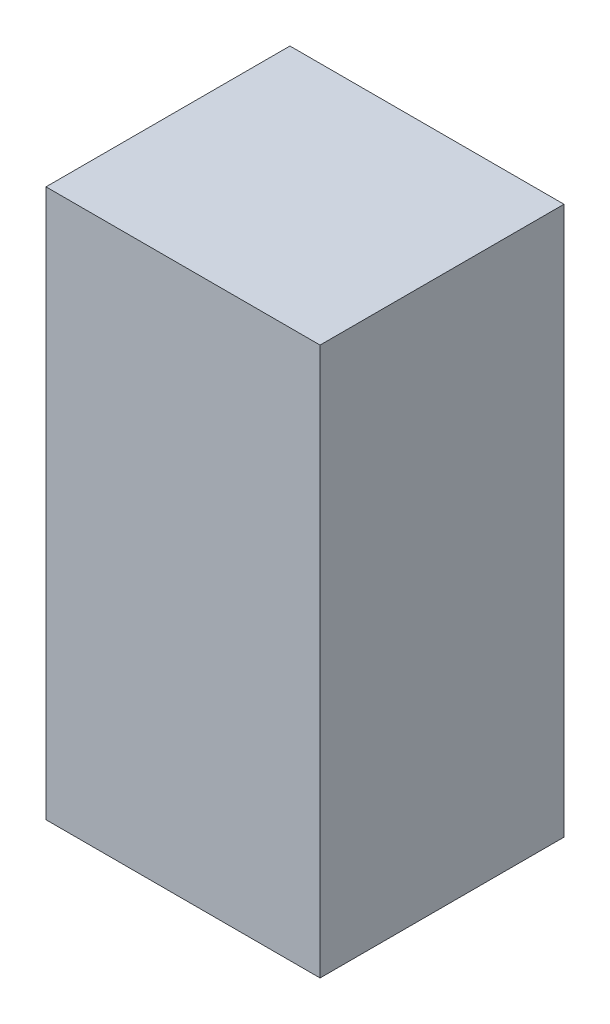
ISO-10303-21;
HEADER;
FILE_DESCRIPTION(('STEP AP214'),'2;1');
FILE_NAME('part.step','',(''),(''),'','','');
FILE_SCHEMA(('AUTOMOTIVE_DESIGN { 1 0 10303 214 1 1 1 1 }'));
ENDSEC;
DATA;
#1=APPLICATION_CONTEXT('core data for automotive mechanical design processes');
#2=APPLICATION_PROTOCOL_DEFINITION('international standard','automotive_design',2000,#1);
#3=PRODUCT_CONTEXT('',#1,'mechanical');
#4=PRODUCT('Part','Part','',(#3));
#5=PRODUCT_RELATED_PRODUCT_CATEGORY('part','',(#4));
#6=PRODUCT_DEFINITION_FORMATION('','',#4);
#7=PRODUCT_DEFINITION_CONTEXT('part definition',#1,'design');
#8=PRODUCT_DEFINITION('design','',#6,#7);
#9=PRODUCT_DEFINITION_SHAPE('','',#8);
#10=(LENGTH_UNIT() NAMED_UNIT(*) SI_UNIT(.MILLI.,.METRE.));
#11=(NAMED_UNIT(*) PLANE_ANGLE_UNIT() SI_UNIT($,.RADIAN.));
#12=(NAMED_UNIT(*) SI_UNIT($,.STERADIAN.) SOLID_ANGLE_UNIT());
#13=UNCERTAINTY_MEASURE_WITH_UNIT(LENGTH_MEASURE(1.E-05),#10,'distance_accuracy_value','');
#14=(GEOMETRIC_REPRESENTATION_CONTEXT(3) GLOBAL_UNCERTAINTY_ASSIGNED_CONTEXT((#13)) GLOBAL_UNIT_ASSIGNED_CONTEXT((#10,
#11,#12)) REPRESENTATION_CONTEXT('',''));
#15=CARTESIAN_POINT('',(0.,0.,0.));
#16=DIRECTION('',(0.,0.,1.));
#17=DIRECTION('',(1.,0.,0.));
#18=AXIS2_PLACEMENT_3D('',#15,#16,#17);
#19=CARTESIAN_POINT('',(10.,-20.,17.8));
#20=DIRECTION('',(-1.,0.,0.));
#21=DIRECTION('',(0.,0.,1.));
#22=AXIS2_PLACEMENT_3D('',#19,#20,#21);
#23=PLANE('',#22);
#24=DIRECTION('',(0.,1.,0.));
#25=VECTOR('',#24,1.);
#26=CARTESIAN_POINT('',(10.,-20.,0.));
#27=LINE('',#26,#25);
#28=CARTESIAN_POINT('',(10.,-20.,0.));
#29=VERTEX_POINT('',#28);
#30=CARTESIAN_POINT('',(10.,20.,0.));
#31=VERTEX_POINT('',#30);
#32=EDGE_CURVE('E99',#29,#31,#27,.T.);
#33=ORIENTED_EDGE('',*,*,#32,.T.);
#34=DIRECTION('',(0.,0.,-1.));
#35=VECTOR('',#34,1.);
#36=CARTESIAN_POINT('',(10.,20.,17.8));
#37=LINE('',#36,#35);
#38=CARTESIAN_POINT('',(10.,20.,17.8));
#39=VERTEX_POINT('',#38);
#40=EDGE_CURVE('E11',#39,#31,#37,.T.);
#41=ORIENTED_EDGE('',*,*,#40,.F.);
#42=DIRECTION('',(0.,1.,0.));
#43=VECTOR('',#42,1.);
#44=CARTESIAN_POINT('',(10.,-20.,17.8));
#45=LINE('',#44,#43);
#46=CARTESIAN_POINT('',(10.,-20.,17.8));
#47=VERTEX_POINT('',#46);
#48=EDGE_CURVE('E86',#47,#39,#45,.T.);
#49=ORIENTED_EDGE('',*,*,#48,.F.);
#50=DIRECTION('',(0.,0.,-1.));
#51=VECTOR('',#50,1.);
#52=CARTESIAN_POINT('',(10.,-20.,17.8));
#53=LINE('',#52,#51);
#54=EDGE_CURVE('E96',#47,#29,#53,.T.);
#55=ORIENTED_EDGE('',*,*,#54,.T.);
#56=EDGE_LOOP('',(#33,#41,#49,#55));
#57=FACE_BOUND('',#56,.T.);
#58=ADVANCED_FACE('F40',(#57),#23,.F.);
#59=CARTESIAN_POINT('',(-10.,20.,17.8));
#60=DIRECTION('',(0.,-1.,0.));
#61=DIRECTION('',(0.,0.,-1.));
#62=AXIS2_PLACEMENT_3D('',#59,#60,#61);
#63=PLANE('',#62);
#64=DIRECTION('',(-1.,0.,0.));
#65=VECTOR('',#64,1.);
#66=CARTESIAN_POINT('',(-10.,20.,0.));
#67=LINE('',#66,#65);
#68=CARTESIAN_POINT('',(-10.,20.,0.));
#69=VERTEX_POINT('',#68);
#70=EDGE_CURVE('E95',#31,#69,#67,.T.);
#71=ORIENTED_EDGE('',*,*,#70,.T.);
#72=DIRECTION('',(0.,0.,-1.));
#73=VECTOR('',#72,1.);
#74=CARTESIAN_POINT('',(-10.,20.,17.8));
#75=LINE('',#74,#73);
#76=CARTESIAN_POINT('',(-10.,20.,17.8));
#77=VERTEX_POINT('',#76);
#78=EDGE_CURVE('E44',#77,#69,#75,.T.);
#79=ORIENTED_EDGE('',*,*,#78,.F.);
#80=DIRECTION('',(-1.,0.,0.));
#81=VECTOR('',#80,1.);
#82=CARTESIAN_POINT('',(-10.,20.,17.8));
#83=LINE('',#82,#81);
#84=EDGE_CURVE('E85',#39,#77,#83,.T.);
#85=ORIENTED_EDGE('',*,*,#84,.F.);
#86=ORIENTED_EDGE('',*,*,#40,.T.);
#87=EDGE_LOOP('',(#71,#79,#85,#86));
#88=FACE_BOUND('',#87,.T.);
#89=ADVANCED_FACE('F93',(#88),#63,.F.);
#90=CARTESIAN_POINT('',(-10.,-20.,17.8));
#91=DIRECTION('',(1.,0.,0.));
#92=DIRECTION('',(0.,0.,-1.));
#93=AXIS2_PLACEMENT_3D('',#90,#91,#92);
#94=PLANE('',#93);
#95=DIRECTION('',(0.,-1.,0.));
#96=VECTOR('',#95,1.);
#97=CARTESIAN_POINT('',(-10.,-20.,0.));
#98=LINE('',#97,#96);
#99=CARTESIAN_POINT('',(-10.,-20.,0.));
#100=VERTEX_POINT('',#99);
#101=EDGE_CURVE('E68',#69,#100,#98,.T.);
#102=ORIENTED_EDGE('',*,*,#101,.T.);
#103=DIRECTION('',(0.,0.,-1.));
#104=VECTOR('',#103,1.);
#105=CARTESIAN_POINT('',(-10.,-20.,17.8));
#106=LINE('',#105,#104);
#107=CARTESIAN_POINT('',(-10.,-20.,17.8));
#108=VERTEX_POINT('',#107);
#109=EDGE_CURVE('E91',#108,#100,#106,.T.);
#110=ORIENTED_EDGE('',*,*,#109,.F.);
#111=DIRECTION('',(0.,-1.,0.));
#112=VECTOR('',#111,1.);
#113=CARTESIAN_POINT('',(-10.,-20.,17.8));
#114=LINE('',#113,#112);
#115=EDGE_CURVE('E88',#77,#108,#114,.T.);
#116=ORIENTED_EDGE('',*,*,#115,.F.);
#117=ORIENTED_EDGE('',*,*,#78,.T.);
#118=EDGE_LOOP('',(#102,#110,#116,#117));
#119=FACE_BOUND('',#118,.T.);
#120=ADVANCED_FACE('F94',(#119),#94,.F.);
#121=CARTESIAN_POINT('',(-10.,-20.,17.8));
#122=DIRECTION('',(0.,1.,0.));
#123=DIRECTION('',(0.,0.,1.));
#124=AXIS2_PLACEMENT_3D('',#121,#122,#123);
#125=PLANE('',#124);
#126=DIRECTION('',(1.,0.,0.));
#127=VECTOR('',#126,1.);
#128=CARTESIAN_POINT('',(-10.,-20.,0.));
#129=LINE('',#128,#127);
#130=EDGE_CURVE('E77',#100,#29,#129,.T.);
#131=ORIENTED_EDGE('',*,*,#130,.T.);
#132=ORIENTED_EDGE('',*,*,#54,.F.);
#133=DIRECTION('',(1.,0.,0.));
#134=VECTOR('',#133,1.);
#135=CARTESIAN_POINT('',(-10.,-20.,17.8));
#136=LINE('',#135,#134);
#137=EDGE_CURVE('E52',#108,#47,#136,.T.);
#138=ORIENTED_EDGE('',*,*,#137,.F.);
#139=ORIENTED_EDGE('',*,*,#109,.T.);
#140=EDGE_LOOP('',(#131,#132,#138,#139));
#141=FACE_BOUND('',#140,.T.);
#142=ADVANCED_FACE('F110',(#141),#125,.F.);
#143=CARTESIAN_POINT('',(0.,0.,17.8));
#144=DIRECTION('',(0.,0.,-1.));
#145=DIRECTION('',(-1.,0.,0.));
#146=AXIS2_PLACEMENT_3D('',#143,#144,#145);
#147=PLANE('',#146);
#148=ORIENTED_EDGE('',*,*,#48,.T.);
#149=ORIENTED_EDGE('',*,*,#84,.T.);
#150=ORIENTED_EDGE('',*,*,#115,.T.);
#151=ORIENTED_EDGE('',*,*,#137,.T.);
#152=EDGE_LOOP('',(#148,#149,#150,#151));
#153=FACE_BOUND('',#152,.T.);
#154=ADVANCED_FACE('F81',(#153),#147,.F.);
#155=CARTESIAN_POINT('',(0.,0.,0.));
#156=DIRECTION('',(0.,0.,-1.));
#157=DIRECTION('',(-1.,0.,0.));
#158=AXIS2_PLACEMENT_3D('',#155,#156,#157);
#159=PLANE('',#158);
#160=ORIENTED_EDGE('',*,*,#32,.F.);
#161=ORIENTED_EDGE('',*,*,#130,.F.);
#162=ORIENTED_EDGE('',*,*,#101,.F.);
#163=ORIENTED_EDGE('',*,*,#70,.F.);
#164=EDGE_LOOP('',(#160,#161,#162,#163));
#165=FACE_BOUND('',#164,.T.);
#166=ADVANCED_FACE('F109',(#165),#159,.T.);
#167=CLOSED_SHELL('',(#58,#89,#120,#142,#154,#166));
#168=MANIFOLD_SOLID_BREP('B2',#167);
#169=ADVANCED_BREP_SHAPE_REPRESENTATION('',(#18,#168),#14);
#170=SHAPE_DEFINITION_REPRESENTATION(#9,#169);
ENDSEC;
END-ISO-10303-21;
